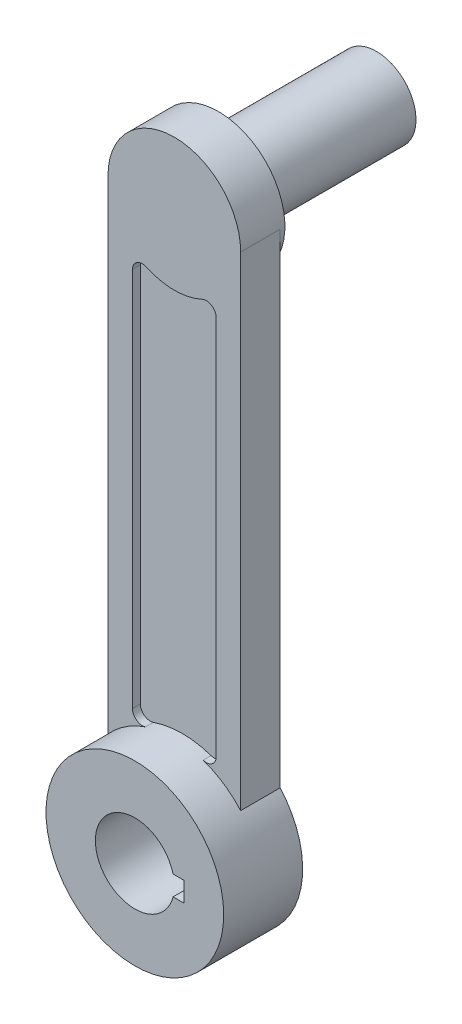
ISO-10303-21;
HEADER;
FILE_DESCRIPTION(('STEP AP214'),'2;1');
FILE_NAME('part.step','',(''),(''),'','','');
FILE_SCHEMA(('AUTOMOTIVE_DESIGN { 1 0 10303 214 1 1 1 1 }'));
ENDSEC;
DATA;
#1=APPLICATION_CONTEXT('core data for automotive mechanical design processes');
#2=APPLICATION_PROTOCOL_DEFINITION('international standard','automotive_design',2000,#1);
#3=PRODUCT_CONTEXT('',#1,'mechanical');
#4=PRODUCT('Part','Part','',(#3));
#5=PRODUCT_RELATED_PRODUCT_CATEGORY('part','',(#4));
#6=PRODUCT_DEFINITION_FORMATION('','',#4);
#7=PRODUCT_DEFINITION_CONTEXT('part definition',#1,'design');
#8=PRODUCT_DEFINITION('design','',#6,#7);
#9=PRODUCT_DEFINITION_SHAPE('','',#8);
#10=(LENGTH_UNIT() NAMED_UNIT(*) SI_UNIT(.MILLI.,.METRE.));
#11=(NAMED_UNIT(*) PLANE_ANGLE_UNIT() SI_UNIT($,.RADIAN.));
#12=(NAMED_UNIT(*) SI_UNIT($,.STERADIAN.) SOLID_ANGLE_UNIT());
#13=UNCERTAINTY_MEASURE_WITH_UNIT(LENGTH_MEASURE(1.E-05),#10,'distance_accuracy_value','');
#14=(GEOMETRIC_REPRESENTATION_CONTEXT(3) GLOBAL_UNCERTAINTY_ASSIGNED_CONTEXT((#13)) GLOBAL_UNIT_ASSIGNED_CONTEXT((#10,
#11,#12)) REPRESENTATION_CONTEXT('',''));
#15=CARTESIAN_POINT('',(0.,0.,0.));
#16=DIRECTION('',(0.,0.,1.));
#17=DIRECTION('',(1.,0.,0.));
#18=AXIS2_PLACEMENT_3D('',#15,#16,#17);
#19=CARTESIAN_POINT('',(0.,0.,-12.7));
#20=DIRECTION('',(0.,0.,1.));
#21=DIRECTION('',(1.,0.,0.));
#22=AXIS2_PLACEMENT_3D('',#19,#20,#21);
#23=PLANE('',#22);
#24=CARTESIAN_POINT('',(0.,174.625,-12.7));
#25=DIRECTION('',(0.,0.,-1.));
#26=DIRECTION('',(-1.,0.,0.));
#27=AXIS2_PLACEMENT_3D('',#24,#25,#26);
#28=CIRCLE('',#27,21.336);
#29=CARTESIAN_POINT('',(-8.95448704663204,155.258997373446,-12.7));
#30=VERTEX_POINT('',#29);
#31=CARTESIAN_POINT('',(-21.3359999999999,174.625,-12.7));
#32=VERTEX_POINT('',#31);
#33=EDGE_CURVE('E63',#30,#32,#28,.T.);
#34=ORIENTED_EDGE('',*,*,#33,.F.);
#35=CARTESIAN_POINT('',(-10.2869999999999,152.377151744494,-12.7));
#36=DIRECTION('',(0.,0.,1.));
#37=DIRECTION('',(1.,0.,0.));
#38=AXIS2_PLACEMENT_3D('',#35,#36,#37);
#39=CIRCLE('',#38,3.175);
#40=CARTESIAN_POINT('',(-13.4619999999999,152.377151744494,-12.7));
#41=VERTEX_POINT('',#40);
#42=EDGE_CURVE('E11',#30,#41,#39,.T.);
#43=ORIENTED_EDGE('',*,*,#42,.T.);
#44=DIRECTION('',(0.,-1.,0.));
#45=VECTOR('',#44,1.);
#46=CARTESIAN_POINT('',(-13.4619999999999,158.072071195707,-12.7));
#47=LINE('',#46,#45);
#48=CARTESIAN_POINT('',(-13.462,30.0373123131881,-12.7));
#49=VERTEX_POINT('',#48);
#50=EDGE_CURVE('E239',#41,#49,#47,.T.);
#51=ORIENTED_EDGE('',*,*,#50,.T.);
#52=CARTESIAN_POINT('',(-10.287,30.0373123131881,-12.7));
#53=DIRECTION('',(0.,0.,1.));
#54=DIRECTION('',(1.,0.,0.));
#55=AXIS2_PLACEMENT_3D('',#52,#53,#54);
#56=CIRCLE('',#55,3.175);
#57=CARTESIAN_POINT('',(-9.25829999999997,27.0335810818693,-12.7));
#58=VERTEX_POINT('',#57);
#59=EDGE_CURVE('E385',#49,#58,#56,.T.);
#60=ORIENTED_EDGE('',*,*,#59,.T.);
#61=CARTESIAN_POINT('',(0.,0.,-12.7));
#62=DIRECTION('',(0.,0.,-1.));
#63=DIRECTION('',(-1.,0.,0.));
#64=AXIS2_PLACEMENT_3D('',#61,#62,#63);
#65=CIRCLE('',#64,28.575);
#66=CARTESIAN_POINT('',(9.25829999999999,27.0335810818693,-12.7));
#67=VERTEX_POINT('',#66);
#68=EDGE_CURVE('E256',#58,#67,#65,.T.);
#69=ORIENTED_EDGE('',*,*,#68,.T.);
#70=CARTESIAN_POINT('',(10.287,30.0373123131881,-12.7));
#71=DIRECTION('',(0.,0.,1.));
#72=DIRECTION('',(1.,0.,0.));
#73=AXIS2_PLACEMENT_3D('',#70,#71,#72);
#74=CIRCLE('',#73,3.175);
#75=CARTESIAN_POINT('',(13.462,30.0373123131881,-12.7));
#76=VERTEX_POINT('',#75);
#77=EDGE_CURVE('E383',#67,#76,#74,.T.);
#78=ORIENTED_EDGE('',*,*,#77,.T.);
#79=DIRECTION('',(0.,1.,0.));
#80=VECTOR('',#79,1.);
#81=CARTESIAN_POINT('',(13.462,25.2052609786132,-12.7));
#82=LINE('',#81,#80);
#83=CARTESIAN_POINT('',(13.462,152.377151744495,-12.7));
#84=VERTEX_POINT('',#83);
#85=EDGE_CURVE('E244',#76,#84,#82,.T.);
#86=ORIENTED_EDGE('',*,*,#85,.T.);
#87=CARTESIAN_POINT('',(10.287,152.377151744495,-12.7));
#88=DIRECTION('',(0.,0.,1.));
#89=DIRECTION('',(1.,0.,0.));
#90=AXIS2_PLACEMENT_3D('',#87,#88,#89);
#91=CIRCLE('',#90,3.175);
#92=CARTESIAN_POINT('',(8.95448704663213,155.258997373446,-12.7));
#93=VERTEX_POINT('',#92);
#94=EDGE_CURVE('E49',#84,#93,#91,.T.);
#95=ORIENTED_EDGE('',*,*,#94,.T.);
#96=CARTESIAN_POINT('',(21.336,174.625,-12.7));
#97=VERTEX_POINT('',#96);
#98=EDGE_CURVE('E56',#97,#93,#28,.T.);
#99=ORIENTED_EDGE('',*,*,#98,.F.);
#100=DIRECTION('',(0.,1.,0.));
#101=VECTOR('',#100,1.);
#102=CARTESIAN_POINT('',(21.336,0.,-12.7));
#103=LINE('',#102,#101);
#104=CARTESIAN_POINT('',(21.336,19.008043797298,-12.7));
#105=VERTEX_POINT('',#104);
#106=EDGE_CURVE('E301',#105,#97,#103,.T.);
#107=ORIENTED_EDGE('',*,*,#106,.F.);
#108=CARTESIAN_POINT('',(0.,0.,-12.7));
#109=DIRECTION('',(0.,0.,1.));
#110=DIRECTION('',(1.,0.,0.));
#111=AXIS2_PLACEMENT_3D('',#108,#109,#110);
#112=CIRCLE('',#111,28.575);
#113=CARTESIAN_POINT('',(-21.336,19.008043797298,-12.7));
#114=VERTEX_POINT('',#113);
#115=EDGE_CURVE('E315',#114,#105,#112,.T.);
#116=ORIENTED_EDGE('',*,*,#115,.F.);
#117=DIRECTION('',(0.,-1.,0.));
#118=VECTOR('',#117,1.);
#119=CARTESIAN_POINT('',(-21.3359999999999,174.625,-12.7));
#120=LINE('',#119,#118);
#121=EDGE_CURVE('E294',#32,#114,#120,.T.);
#122=ORIENTED_EDGE('',*,*,#121,.F.);
#123=EDGE_LOOP('',(#34,#43,#51,#60,#69,#78,#86,#95,#99,#107,#116,#122));
#124=FACE_BOUND('',#123,.T.);
#125=DIRECTION('',(1.,0.,0.));
#126=VECTOR('',#125,1.);
#127=CARTESIAN_POINT('',(0.,3.175,-12.7));
#128=LINE('',#127,#126);
#129=CARTESIAN_POINT('',(12.2967221242085,3.175,-12.7));
#130=VERTEX_POINT('',#129);
#131=CARTESIAN_POINT('',(15.875,3.175,-12.7));
#132=VERTEX_POINT('',#131);
#133=EDGE_CURVE('E231',#130,#132,#128,.T.);
#134=ORIENTED_EDGE('',*,*,#133,.F.);
#135=CARTESIAN_POINT('',(0.,0.,-12.7));
#136=DIRECTION('',(0.,0.,1.));
#137=DIRECTION('',(1.,0.,0.));
#138=AXIS2_PLACEMENT_3D('',#135,#136,#137);
#139=CIRCLE('',#138,12.7);
#140=CARTESIAN_POINT('',(12.2967221242085,-3.175,-12.7));
#141=VERTEX_POINT('',#140);
#142=EDGE_CURVE('E236',#130,#141,#139,.T.);
#143=ORIENTED_EDGE('',*,*,#142,.T.);
#144=DIRECTION('',(-1.,0.,0.));
#145=VECTOR('',#144,1.);
#146=CARTESIAN_POINT('',(0.,-3.175,-12.7));
#147=LINE('',#146,#145);
#148=CARTESIAN_POINT('',(15.875,-3.175,-12.7));
#149=VERTEX_POINT('',#148);
#150=EDGE_CURVE('E228',#149,#141,#147,.T.);
#151=ORIENTED_EDGE('',*,*,#150,.F.);
#152=DIRECTION('',(0.,1.,0.));
#153=VECTOR('',#152,1.);
#154=CARTESIAN_POINT('',(15.875,0.,-12.7));
#155=LINE('',#154,#153);
#156=EDGE_CURVE('E209',#149,#132,#155,.T.);
#157=ORIENTED_EDGE('',*,*,#156,.T.);
#158=EDGE_LOOP('',(#134,#143,#151,#157));
#159=FACE_BOUND('',#158,.T.);
#160=ADVANCED_FACE('F41',(#124,#159),#23,.F.);
#161=CARTESIAN_POINT('',(0.,0.,12.7));
#162=DIRECTION('',(0.,0.,1.));
#163=DIRECTION('',(1.,0.,0.));
#164=AXIS2_PLACEMENT_3D('',#161,#162,#163);
#165=PLANE('',#164);
#166=CARTESIAN_POINT('',(0.,0.,12.7));
#167=DIRECTION('',(0.,0.,1.));
#168=DIRECTION('',(1.,0.,0.));
#169=AXIS2_PLACEMENT_3D('',#166,#167,#168);
#170=CIRCLE('',#169,28.575);
#171=CARTESIAN_POINT('',(28.575,0.,12.7));
#172=VERTEX_POINT('',#171);
#173=EDGE_CURVE('E316',#172,#172,#170,.T.);
#174=ORIENTED_EDGE('',*,*,#173,.T.);
#175=EDGE_LOOP('',(#174));
#176=FACE_BOUND('',#175,.T.);
#177=CARTESIAN_POINT('',(0.,0.,12.7));
#178=DIRECTION('',(0.,0.,1.));
#179=DIRECTION('',(1.,0.,0.));
#180=AXIS2_PLACEMENT_3D('',#177,#178,#179);
#181=CIRCLE('',#180,12.7);
#182=CARTESIAN_POINT('',(12.2967221242085,3.175,12.7));
#183=VERTEX_POINT('',#182);
#184=CARTESIAN_POINT('',(12.2967221242085,-3.175,12.7));
#185=VERTEX_POINT('',#184);
#186=EDGE_CURVE('E234',#183,#185,#181,.T.);
#187=ORIENTED_EDGE('',*,*,#186,.F.);
#188=DIRECTION('',(1.,0.,0.));
#189=VECTOR('',#188,1.);
#190=CARTESIAN_POINT('',(0.,3.175,12.7));
#191=LINE('',#190,#189);
#192=CARTESIAN_POINT('',(15.875,3.175,12.7));
#193=VERTEX_POINT('',#192);
#194=EDGE_CURVE('E213',#183,#193,#191,.T.);
#195=ORIENTED_EDGE('',*,*,#194,.T.);
#196=DIRECTION('',(0.,1.,0.));
#197=VECTOR('',#196,1.);
#198=CARTESIAN_POINT('',(15.875,-3.175,12.7));
#199=LINE('',#198,#197);
#200=CARTESIAN_POINT('',(15.875,-3.175,12.7));
#201=VERTEX_POINT('',#200);
#202=EDGE_CURVE('E206',#201,#193,#199,.T.);
#203=ORIENTED_EDGE('',*,*,#202,.F.);
#204=DIRECTION('',(-1.,0.,0.));
#205=VECTOR('',#204,1.);
#206=CARTESIAN_POINT('',(15.875,-3.175,12.7));
#207=LINE('',#206,#205);
#208=EDGE_CURVE('E216',#201,#185,#207,.T.);
#209=ORIENTED_EDGE('',*,*,#208,.T.);
#210=EDGE_LOOP('',(#187,#195,#203,#209));
#211=FACE_BOUND('',#210,.T.);
#212=ADVANCED_FACE('F224',(#176,#211),#165,.T.);
#213=CARTESIAN_POINT('',(0.,0.,-65.024));
#214=DIRECTION('',(0.,0.,1.));
#215=DIRECTION('',(1.,0.,0.));
#216=AXIS2_PLACEMENT_3D('',#213,#214,#215);
#217=CYLINDRICAL_SURFACE('',#216,12.7);
#218=DIRECTION('',(0.,0.,1.));
#219=VECTOR('',#218,1.);
#220=CARTESIAN_POINT('',(12.2967221242085,3.175,-65.024));
#221=LINE('',#220,#219);
#222=EDGE_CURVE('E325',#183,#130,#221,.F.);
#223=ORIENTED_EDGE('',*,*,#222,.F.);
#224=ORIENTED_EDGE('',*,*,#186,.T.);
#225=DIRECTION('',(0.,0.,1.));
#226=VECTOR('',#225,1.);
#227=CARTESIAN_POINT('',(12.2967221242085,-3.175,-65.024));
#228=LINE('',#227,#226);
#229=EDGE_CURVE('E219',#141,#185,#228,.T.);
#230=ORIENTED_EDGE('',*,*,#229,.F.);
#231=ORIENTED_EDGE('',*,*,#142,.F.);
#232=EDGE_LOOP('',(#223,#224,#230,#231));
#233=FACE_BOUND('',#232,.T.);
#234=ADVANCED_FACE('F480',(#233),#217,.F.);
#235=CARTESIAN_POINT('',(0.,174.625,0.));
#236=DIRECTION('',(0.,0.,1.));
#237=DIRECTION('',(1.,0.,0.));
#238=AXIS2_PLACEMENT_3D('',#235,#236,#237);
#239=PLANE('',#238);
#240=DIRECTION('',(0.,-1.,0.));
#241=VECTOR('',#240,1.);
#242=CARTESIAN_POINT('',(-13.4619999999999,158.072071195707,0.));
#243=LINE('',#242,#241);
#244=CARTESIAN_POINT('',(-13.4619999999999,152.377151744495,0.));
#245=VERTEX_POINT('',#244);
#246=CARTESIAN_POINT('',(-13.462,30.0373123131881,0.));
#247=VERTEX_POINT('',#246);
#248=EDGE_CURVE('E265',#245,#247,#243,.T.);
#249=ORIENTED_EDGE('',*,*,#248,.F.);
#250=CARTESIAN_POINT('',(-10.2869999999999,152.377151744495,0.));
#251=DIRECTION('',(0.,0.,1.));
#252=DIRECTION('',(1.,0.,0.));
#253=AXIS2_PLACEMENT_3D('',#250,#251,#252);
#254=CIRCLE('',#253,3.175);
#255=CARTESIAN_POINT('',(-8.95448704663205,155.258997373446,0.));
#256=VERTEX_POINT('',#255);
#257=EDGE_CURVE('E392',#245,#256,#254,.F.);
#258=ORIENTED_EDGE('',*,*,#257,.T.);
#259=CARTESIAN_POINT('',(0.,174.625,0.));
#260=DIRECTION('',(0.,0.,1.));
#261=DIRECTION('',(1.,0.,0.));
#262=AXIS2_PLACEMENT_3D('',#259,#260,#261);
#263=CIRCLE('',#262,21.336);
#264=CARTESIAN_POINT('',(8.95448704663212,155.258997373446,0.));
#265=VERTEX_POINT('',#264);
#266=EDGE_CURVE('E253',#256,#265,#263,.T.);
#267=ORIENTED_EDGE('',*,*,#266,.T.);
#268=CARTESIAN_POINT('',(10.287,152.377151744495,0.));
#269=DIRECTION('',(0.,0.,1.));
#270=DIRECTION('',(1.,0.,0.));
#271=AXIS2_PLACEMENT_3D('',#268,#269,#270);
#272=CIRCLE('',#271,3.175);
#273=CARTESIAN_POINT('',(13.462,152.377151744495,0.));
#274=VERTEX_POINT('',#273);
#275=EDGE_CURVE('E394',#265,#274,#272,.F.);
#276=ORIENTED_EDGE('',*,*,#275,.T.);
#277=DIRECTION('',(0.,-1.,0.));
#278=VECTOR('',#277,1.);
#279=CARTESIAN_POINT('',(13.462,158.072071195707,0.));
#280=LINE('',#279,#278);
#281=CARTESIAN_POINT('',(13.462,30.0373123131881,0.));
#282=VERTEX_POINT('',#281);
#283=EDGE_CURVE('E277',#274,#282,#280,.T.);
#284=ORIENTED_EDGE('',*,*,#283,.T.);
#285=CARTESIAN_POINT('',(10.287,30.0373123131881,0.));
#286=DIRECTION('',(0.,0.,1.));
#287=DIRECTION('',(1.,0.,0.));
#288=AXIS2_PLACEMENT_3D('',#285,#286,#287);
#289=CIRCLE('',#288,3.175);
#290=CARTESIAN_POINT('',(9.25829999999999,27.0335810818693,0.));
#291=VERTEX_POINT('',#290);
#292=EDGE_CURVE('E389',#282,#291,#289,.F.);
#293=ORIENTED_EDGE('',*,*,#292,.T.);
#294=CARTESIAN_POINT('',(0.,0.,0.));
#295=DIRECTION('',(0.,0.,1.));
#296=DIRECTION('',(1.,0.,0.));
#297=AXIS2_PLACEMENT_3D('',#294,#295,#296);
#298=CIRCLE('',#297,28.575);
#299=CARTESIAN_POINT('',(21.336,19.008043797298,0.));
#300=VERTEX_POINT('',#299);
#301=EDGE_CURVE('E322',#300,#291,#298,.T.);
#302=ORIENTED_EDGE('',*,*,#301,.F.);
#303=DIRECTION('',(0.,1.,0.));
#304=VECTOR('',#303,1.);
#305=CARTESIAN_POINT('',(21.336,0.,0.));
#306=LINE('',#305,#304);
#307=CARTESIAN_POINT('',(21.336,174.625,0.));
#308=VERTEX_POINT('',#307);
#309=EDGE_CURVE('E292',#300,#308,#306,.T.);
#310=ORIENTED_EDGE('',*,*,#309,.T.);
#311=CARTESIAN_POINT('',(0.,174.625,0.));
#312=DIRECTION('',(0.,0.,1.));
#313=DIRECTION('',(1.,0.,0.));
#314=AXIS2_PLACEMENT_3D('',#311,#312,#313);
#315=CIRCLE('',#314,21.336);
#316=CARTESIAN_POINT('',(-21.3359999999999,174.625,0.));
#317=VERTEX_POINT('',#316);
#318=EDGE_CURVE('E290',#308,#317,#315,.T.);
#319=ORIENTED_EDGE('',*,*,#318,.T.);
#320=DIRECTION('',(0.,-1.,0.));
#321=VECTOR('',#320,1.);
#322=CARTESIAN_POINT('',(-21.3359999999999,174.625,0.));
#323=LINE('',#322,#321);
#324=CARTESIAN_POINT('',(-21.336,19.008043797298,0.));
#325=VERTEX_POINT('',#324);
#326=EDGE_CURVE('E295',#317,#325,#323,.T.);
#327=ORIENTED_EDGE('',*,*,#326,.T.);
#328=CARTESIAN_POINT('',(-9.25829999999998,27.0335810818693,0.));
#329=VERTEX_POINT('',#328);
#330=EDGE_CURVE('E319',#329,#325,#298,.T.);
#331=ORIENTED_EDGE('',*,*,#330,.F.);
#332=CARTESIAN_POINT('',(-10.287,30.0373123131881,0.));
#333=DIRECTION('',(0.,0.,1.));
#334=DIRECTION('',(1.,0.,0.));
#335=AXIS2_PLACEMENT_3D('',#332,#333,#334);
#336=CIRCLE('',#335,3.175);
#337=EDGE_CURVE('E387',#329,#247,#336,.F.);
#338=ORIENTED_EDGE('',*,*,#337,.T.);
#339=EDGE_LOOP('',(#249,#258,#267,#276,#284,#293,#302,#310,#319,#327,#331,#338));
#340=FACE_BOUND('',#339,.T.);
#341=ADVANCED_FACE('F425',(#340),#239,.T.);
#342=CARTESIAN_POINT('',(0.,0.,12.7));
#343=DIRECTION('',(0.,0.,-1.));
#344=DIRECTION('',(-1.,0.,0.));
#345=AXIS2_PLACEMENT_3D('',#342,#343,#344);
#346=CYLINDRICAL_SURFACE('',#345,28.575);
#347=ORIENTED_EDGE('',*,*,#173,.F.);
#348=EDGE_LOOP('',(#347));
#349=FACE_BOUND('',#348,.T.);
#350=CARTESIAN_POINT('',(0.,0.,-2.54));
#351=DIRECTION('',(0.,0.,1.));
#352=DIRECTION('',(1.,0.,0.));
#353=AXIS2_PLACEMENT_3D('',#350,#351,#352);
#354=CIRCLE('',#353,28.575);
#355=CARTESIAN_POINT('',(9.25829999999999,27.0335810818693,-2.54));
#356=VERTEX_POINT('',#355);
#357=CARTESIAN_POINT('',(-9.25829999999998,27.0335810818693,-2.54));
#358=VERTEX_POINT('',#357);
#359=EDGE_CURVE('E268',#356,#358,#354,.T.);
#360=ORIENTED_EDGE('',*,*,#359,.T.);
#361=DIRECTION('',(0.,0.,-1.));
#362=VECTOR('',#361,1.);
#363=CARTESIAN_POINT('',(-9.25829999999998,27.0335810818693,12.7));
#364=LINE('',#363,#362);
#365=EDGE_CURVE('E352',#358,#329,#364,.F.);
#366=ORIENTED_EDGE('',*,*,#365,.T.);
#367=ORIENTED_EDGE('',*,*,#330,.T.);
#368=DIRECTION('',(0.,0.,-1.));
#369=VECTOR('',#368,1.);
#370=CARTESIAN_POINT('',(-21.336,19.008043797298,12.7));
#371=LINE('',#370,#369);
#372=EDGE_CURVE('E312',#325,#114,#371,.T.);
#373=ORIENTED_EDGE('',*,*,#372,.T.);
#374=ORIENTED_EDGE('',*,*,#115,.T.);
#375=DIRECTION('',(0.,0.,-1.));
#376=VECTOR('',#375,1.);
#377=CARTESIAN_POINT('',(21.336,19.008043797298,12.7));
#378=LINE('',#377,#376);
#379=EDGE_CURVE('E309',#105,#300,#378,.F.);
#380=ORIENTED_EDGE('',*,*,#379,.T.);
#381=ORIENTED_EDGE('',*,*,#301,.T.);
#382=DIRECTION('',(0.,0.,-1.));
#383=VECTOR('',#382,1.);
#384=CARTESIAN_POINT('',(9.25829999999999,27.0335810818693,12.7));
#385=LINE('',#384,#383);
#386=EDGE_CURVE('E350',#291,#356,#385,.T.);
#387=ORIENTED_EDGE('',*,*,#386,.T.);
#388=EDGE_LOOP('',(#360,#366,#367,#373,#374,#380,#381,#387));
#389=FACE_BOUND('',#388,.T.);
#390=ADVANCED_FACE('F422',(#349,#389),#346,.T.);
#391=CARTESIAN_POINT('',(-21.3359999999999,174.625,-213.253267500183));
#392=DIRECTION('',(-1.,0.,0.));
#393=DIRECTION('',(0.,-1.,0.));
#394=AXIS2_PLACEMENT_3D('',#391,#392,#393);
#395=PLANE('',#394);
#396=ORIENTED_EDGE('',*,*,#372,.F.);
#397=ORIENTED_EDGE('',*,*,#326,.F.);
#398=DIRECTION('',(0.,0.,1.));
#399=VECTOR('',#398,1.);
#400=CARTESIAN_POINT('',(-21.3359999999999,174.625,-213.253267500183));
#401=LINE('',#400,#399);
#402=EDGE_CURVE('E307',#32,#317,#401,.T.);
#403=ORIENTED_EDGE('',*,*,#402,.F.);
#404=ORIENTED_EDGE('',*,*,#121,.T.);
#405=EDGE_LOOP('',(#396,#397,#403,#404));
#406=FACE_BOUND('',#405,.T.);
#407=ADVANCED_FACE('F419',(#406),#395,.T.);
#408=CARTESIAN_POINT('',(21.336,0.,-213.253267500183));
#409=DIRECTION('',(1.,0.,0.));
#410=DIRECTION('',(0.,0.,-1.));
#411=AXIS2_PLACEMENT_3D('',#408,#409,#410);
#412=PLANE('',#411);
#413=ORIENTED_EDGE('',*,*,#379,.F.);
#414=ORIENTED_EDGE('',*,*,#106,.T.);
#415=DIRECTION('',(0.,0.,1.));
#416=VECTOR('',#415,1.);
#417=CARTESIAN_POINT('',(21.336,174.625,-213.253267500183));
#418=LINE('',#417,#416);
#419=EDGE_CURVE('E304',#97,#308,#418,.T.);
#420=ORIENTED_EDGE('',*,*,#419,.T.);
#421=ORIENTED_EDGE('',*,*,#309,.F.);
#422=EDGE_LOOP('',(#413,#414,#420,#421));
#423=FACE_BOUND('',#422,.T.);
#424=ADVANCED_FACE('F429',(#423),#412,.T.);
#425=CARTESIAN_POINT('',(0.,174.625,-213.253267500183));
#426=DIRECTION('',(0.,0.,1.));
#427=DIRECTION('',(1.,0.,0.));
#428=AXIS2_PLACEMENT_3D('',#425,#426,#427);
#429=CYLINDRICAL_SURFACE('',#428,21.336);
#430=ORIENTED_EDGE('',*,*,#98,.T.);
#431=DIRECTION('',(0.,0.,1.));
#432=VECTOR('',#431,1.);
#433=CARTESIAN_POINT('',(8.95448704663213,155.258997373446,-213.253267500183));
#434=LINE('',#433,#432);
#435=CARTESIAN_POINT('',(8.95448704663212,155.258997373446,-10.16));
#436=VERTEX_POINT('',#435);
#437=EDGE_CURVE('E381',#93,#436,#434,.T.);
#438=ORIENTED_EDGE('',*,*,#437,.T.);
#439=CARTESIAN_POINT('',(0.,174.625,-10.16));
#440=DIRECTION('',(0.,0.,-1.));
#441=DIRECTION('',(-1.,0.,0.));
#442=AXIS2_PLACEMENT_3D('',#439,#440,#441);
#443=CIRCLE('',#442,21.336);
#444=CARTESIAN_POINT('',(-8.95448704663204,155.258997373446,-10.16));
#445=VERTEX_POINT('',#444);
#446=EDGE_CURVE('E240',#436,#445,#443,.T.);
#447=ORIENTED_EDGE('',*,*,#446,.T.);
#448=DIRECTION('',(0.,0.,1.));
#449=VECTOR('',#448,1.);
#450=CARTESIAN_POINT('',(-8.95448704663205,155.258997373446,-213.253267500183));
#451=LINE('',#450,#449);
#452=EDGE_CURVE('E378',#445,#30,#451,.F.);
#453=ORIENTED_EDGE('',*,*,#452,.T.);
#454=ORIENTED_EDGE('',*,*,#33,.T.);
#455=ORIENTED_EDGE('',*,*,#402,.T.);
#456=ORIENTED_EDGE('',*,*,#318,.F.);
#457=ORIENTED_EDGE('',*,*,#419,.F.);
#458=EDGE_LOOP('',(#430,#438,#447,#453,#454,#455,#456,#457));
#459=FACE_BOUND('',#458,.T.);
#460=CARTESIAN_POINT('',(0.,174.625,-14.224));
#461=DIRECTION('',(0.,0.,-1.));
#462=DIRECTION('',(-1.,0.,0.));
#463=AXIS2_PLACEMENT_3D('',#460,#461,#462);
#464=CIRCLE('',#463,21.336);
#465=CARTESIAN_POINT('',(-21.3359999999999,174.625,-14.224));
#466=VERTEX_POINT('',#465);
#467=EDGE_CURVE('E285',#466,#466,#464,.T.);
#468=ORIENTED_EDGE('',*,*,#467,.F.);
#469=EDGE_LOOP('',(#468));
#470=FACE_BOUND('',#469,.T.);
#471=ADVANCED_FACE('F404',(#459,#470),#429,.T.);
#472=CARTESIAN_POINT('',(0.,174.625,-14.224));
#473=DIRECTION('',(0.,0.,-1.));
#474=DIRECTION('',(-1.,0.,0.));
#475=AXIS2_PLACEMENT_3D('',#472,#473,#474);
#476=PLANE('',#475);
#477=CARTESIAN_POINT('',(0.,174.625,-14.224));
#478=DIRECTION('',(0.,0.,-1.));
#479=DIRECTION('',(-1.,0.,0.));
#480=AXIS2_PLACEMENT_3D('',#477,#478,#479);
#481=CIRCLE('',#480,12.7);
#482=CARTESIAN_POINT('',(-12.7,174.625,-14.224));
#483=VERTEX_POINT('',#482);
#484=EDGE_CURVE('E274',#483,#483,#481,.T.);
#485=ORIENTED_EDGE('',*,*,#484,.F.);
#486=EDGE_LOOP('',(#485));
#487=FACE_BOUND('',#486,.T.);
#488=ORIENTED_EDGE('',*,*,#467,.T.);
#489=EDGE_LOOP('',(#488));
#490=FACE_BOUND('',#489,.T.);
#491=ADVANCED_FACE('F537',(#487,#490),#476,.T.);
#492=CARTESIAN_POINT('',(0.,174.625,-65.024));
#493=DIRECTION('',(0.,0.,1.));
#494=DIRECTION('',(1.,0.,0.));
#495=AXIS2_PLACEMENT_3D('',#492,#493,#494);
#496=CYLINDRICAL_SURFACE('',#495,12.7);
#497=CARTESIAN_POINT('',(0.,174.625,-65.024));
#498=DIRECTION('',(0.,0.,-1.));
#499=DIRECTION('',(-1.,0.,0.));
#500=AXIS2_PLACEMENT_3D('',#497,#498,#499);
#501=CIRCLE('',#500,12.7);
#502=CARTESIAN_POINT('',(-12.7,174.625,-65.024));
#503=VERTEX_POINT('',#502);
#504=EDGE_CURVE('E282',#503,#503,#501,.T.);
#505=ORIENTED_EDGE('',*,*,#504,.F.);
#506=EDGE_LOOP('',(#505));
#507=FACE_BOUND('',#506,.T.);
#508=ORIENTED_EDGE('',*,*,#484,.T.);
#509=EDGE_LOOP('',(#508));
#510=FACE_BOUND('',#509,.T.);
#511=ADVANCED_FACE('F533',(#507,#510),#496,.T.);
#512=CARTESIAN_POINT('',(0.,174.625,-65.024));
#513=DIRECTION('',(0.,0.,-1.));
#514=DIRECTION('',(-1.,0.,0.));
#515=AXIS2_PLACEMENT_3D('',#512,#513,#514);
#516=PLANE('',#515);
#517=ORIENTED_EDGE('',*,*,#504,.T.);
#518=EDGE_LOOP('',(#517));
#519=FACE_BOUND('',#518,.T.);
#520=ADVANCED_FACE('F530',(#519),#516,.T.);
#521=CARTESIAN_POINT('',(0.,174.625,-2.54));
#522=DIRECTION('',(0.,0.,1.));
#523=DIRECTION('',(1.,0.,0.));
#524=AXIS2_PLACEMENT_3D('',#521,#522,#523);
#525=CYLINDRICAL_SURFACE('',#524,21.336);
#526=ORIENTED_EDGE('',*,*,#266,.F.);
#527=DIRECTION('',(0.,0.,1.));
#528=VECTOR('',#527,1.);
#529=CARTESIAN_POINT('',(-8.95448704663205,155.258997373446,-2.54));
#530=LINE('',#529,#528);
#531=CARTESIAN_POINT('',(-8.95448704663205,155.258997373446,-2.54));
#532=VERTEX_POINT('',#531);
#533=EDGE_CURVE('E376',#256,#532,#530,.F.);
#534=ORIENTED_EDGE('',*,*,#533,.T.);
#535=CARTESIAN_POINT('',(0.,174.625,-2.54));
#536=DIRECTION('',(0.,0.,1.));
#537=DIRECTION('',(1.,0.,0.));
#538=AXIS2_PLACEMENT_3D('',#535,#536,#537);
#539=CIRCLE('',#538,21.336);
#540=CARTESIAN_POINT('',(8.95448704663212,155.258997373446,-2.54));
#541=VERTEX_POINT('',#540);
#542=EDGE_CURVE('E261',#532,#541,#539,.T.);
#543=ORIENTED_EDGE('',*,*,#542,.T.);
#544=DIRECTION('',(0.,0.,1.));
#545=VECTOR('',#544,1.);
#546=CARTESIAN_POINT('',(8.95448704663212,155.258997373446,-2.54));
#547=LINE('',#546,#545);
#548=EDGE_CURVE('E373',#541,#265,#547,.T.);
#549=ORIENTED_EDGE('',*,*,#548,.T.);
#550=EDGE_LOOP('',(#526,#534,#543,#549));
#551=FACE_BOUND('',#550,.T.);
#552=ADVANCED_FACE('F451',(#551),#525,.T.);
#553=CARTESIAN_POINT('',(13.462,158.072071195707,-2.54));
#554=DIRECTION('',(-1.,0.,0.));
#555=DIRECTION('',(0.,-1.,0.));
#556=AXIS2_PLACEMENT_3D('',#553,#554,#555);
#557=PLANE('',#556);
#558=DIRECTION('',(0.,-1.,0.));
#559=VECTOR('',#558,1.);
#560=CARTESIAN_POINT('',(13.462,158.072071195707,-2.54));
#561=LINE('',#560,#559);
#562=CARTESIAN_POINT('',(13.462,152.377151744495,-2.54));
#563=VERTEX_POINT('',#562);
#564=CARTESIAN_POINT('',(13.462,30.0373123131881,-2.54));
#565=VERTEX_POINT('',#564);
#566=EDGE_CURVE('E264',#563,#565,#561,.T.);
#567=ORIENTED_EDGE('',*,*,#566,.T.);
#568=DIRECTION('',(0.,0.,-1.));
#569=VECTOR('',#568,1.);
#570=CARTESIAN_POINT('',(13.462,30.0373123131881,-2.54));
#571=LINE('',#570,#569);
#572=EDGE_CURVE('E370',#565,#282,#571,.F.);
#573=ORIENTED_EDGE('',*,*,#572,.T.);
#574=ORIENTED_EDGE('',*,*,#283,.F.);
#575=DIRECTION('',(0.,0.,-1.));
#576=VECTOR('',#575,1.);
#577=CARTESIAN_POINT('',(13.462,152.377151744495,-2.54));
#578=LINE('',#577,#576);
#579=EDGE_CURVE('E368',#274,#563,#578,.T.);
#580=ORIENTED_EDGE('',*,*,#579,.T.);
#581=EDGE_LOOP('',(#567,#573,#574,#580));
#582=FACE_BOUND('',#581,.T.);
#583=ADVANCED_FACE('F443',(#582),#557,.T.);
#584=CARTESIAN_POINT('',(-13.4619999999999,158.072071195707,-2.54));
#585=DIRECTION('',(-1.,0.,0.));
#586=DIRECTION('',(0.,-1.,0.));
#587=AXIS2_PLACEMENT_3D('',#584,#585,#586);
#588=PLANE('',#587);
#589=ORIENTED_EDGE('',*,*,#248,.T.);
#590=DIRECTION('',(0.,0.,1.));
#591=VECTOR('',#590,1.);
#592=CARTESIAN_POINT('',(-13.462,30.0373123131881,-2.54));
#593=LINE('',#592,#591);
#594=CARTESIAN_POINT('',(-13.462,30.0373123131881,-2.54));
#595=VERTEX_POINT('',#594);
#596=EDGE_CURVE('E358',#247,#595,#593,.F.);
#597=ORIENTED_EDGE('',*,*,#596,.T.);
#598=DIRECTION('',(0.,-1.,0.));
#599=VECTOR('',#598,1.);
#600=CARTESIAN_POINT('',(-13.4619999999999,158.072071195707,-2.54));
#601=LINE('',#600,#599);
#602=CARTESIAN_POINT('',(-13.4619999999999,152.377151744495,-2.54));
#603=VERTEX_POINT('',#602);
#604=EDGE_CURVE('E271',#603,#595,#601,.T.);
#605=ORIENTED_EDGE('',*,*,#604,.F.);
#606=DIRECTION('',(0.,0.,1.));
#607=VECTOR('',#606,1.);
#608=CARTESIAN_POINT('',(-13.4619999999999,152.377151744495,-2.54));
#609=LINE('',#608,#607);
#610=EDGE_CURVE('E355',#603,#245,#609,.T.);
#611=ORIENTED_EDGE('',*,*,#610,.T.);
#612=EDGE_LOOP('',(#589,#597,#605,#611));
#613=FACE_BOUND('',#612,.T.);
#614=ADVANCED_FACE('F460',(#613),#588,.F.);
#615=CARTESIAN_POINT('',(0.,174.625,-2.54));
#616=DIRECTION('',(0.,0.,1.));
#617=DIRECTION('',(1.,0.,0.));
#618=AXIS2_PLACEMENT_3D('',#615,#616,#617);
#619=PLANE('',#618);
#620=ORIENTED_EDGE('',*,*,#604,.T.);
#621=CARTESIAN_POINT('',(-10.287,30.0373123131881,-2.54));
#622=DIRECTION('',(0.,0.,1.));
#623=DIRECTION('',(1.,0.,0.));
#624=AXIS2_PLACEMENT_3D('',#621,#622,#623);
#625=CIRCLE('',#624,3.175);
#626=EDGE_CURVE('E366',#595,#358,#625,.T.);
#627=ORIENTED_EDGE('',*,*,#626,.T.);
#628=ORIENTED_EDGE('',*,*,#359,.F.);
#629=CARTESIAN_POINT('',(10.287,30.0373123131881,-2.54));
#630=DIRECTION('',(0.,0.,1.));
#631=DIRECTION('',(1.,0.,0.));
#632=AXIS2_PLACEMENT_3D('',#629,#630,#631);
#633=CIRCLE('',#632,3.175);
#634=EDGE_CURVE('E364',#356,#565,#633,.T.);
#635=ORIENTED_EDGE('',*,*,#634,.T.);
#636=ORIENTED_EDGE('',*,*,#566,.F.);
#637=CARTESIAN_POINT('',(10.287,152.377151744495,-2.54));
#638=DIRECTION('',(0.,0.,1.));
#639=DIRECTION('',(1.,0.,0.));
#640=AXIS2_PLACEMENT_3D('',#637,#638,#639);
#641=CIRCLE('',#640,3.175);
#642=EDGE_CURVE('E360',#563,#541,#641,.T.);
#643=ORIENTED_EDGE('',*,*,#642,.T.);
#644=ORIENTED_EDGE('',*,*,#542,.F.);
#645=CARTESIAN_POINT('',(-10.2869999999999,152.377151744495,-2.54));
#646=DIRECTION('',(0.,0.,1.));
#647=DIRECTION('',(1.,0.,0.));
#648=AXIS2_PLACEMENT_3D('',#645,#646,#647);
#649=CIRCLE('',#648,3.175);
#650=EDGE_CURVE('E362',#532,#603,#649,.T.);
#651=ORIENTED_EDGE('',*,*,#650,.T.);
#652=EDGE_LOOP('',(#620,#627,#628,#635,#636,#643,#644,#651));
#653=FACE_BOUND('',#652,.T.);
#654=ADVANCED_FACE('F436',(#653),#619,.T.);
#655=CARTESIAN_POINT('',(-13.4619999999999,158.072071195707,-10.16));
#656=DIRECTION('',(1.,0.,0.));
#657=DIRECTION('',(0.,1.,0.));
#658=AXIS2_PLACEMENT_3D('',#655,#656,#657);
#659=PLANE('',#658);
#660=DIRECTION('',(0.,-1.,0.));
#661=VECTOR('',#660,1.);
#662=CARTESIAN_POINT('',(-13.4619999999999,158.072071195707,-10.16));
#663=LINE('',#662,#661);
#664=CARTESIAN_POINT('',(-13.4619999999999,152.377151744494,-10.16));
#665=VERTEX_POINT('',#664);
#666=CARTESIAN_POINT('',(-13.462,30.0373123131881,-10.16));
#667=VERTEX_POINT('',#666);
#668=EDGE_CURVE('E243',#665,#667,#663,.T.);
#669=ORIENTED_EDGE('',*,*,#668,.T.);
#670=DIRECTION('',(0.,0.,1.));
#671=VECTOR('',#670,1.);
#672=CARTESIAN_POINT('',(-13.462,30.0373123131881,-12.7));
#673=LINE('',#672,#671);
#674=EDGE_CURVE('E347',#667,#49,#673,.F.);
#675=ORIENTED_EDGE('',*,*,#674,.T.);
#676=ORIENTED_EDGE('',*,*,#50,.F.);
#677=DIRECTION('',(0.,0.,-1.));
#678=VECTOR('',#677,1.);
#679=CARTESIAN_POINT('',(-13.4619999999999,152.377151744494,-10.16));
#680=LINE('',#679,#678);
#681=EDGE_CURVE('E345',#41,#665,#680,.F.);
#682=ORIENTED_EDGE('',*,*,#681,.T.);
#683=EDGE_LOOP('',(#669,#675,#676,#682));
#684=FACE_BOUND('',#683,.T.);
#685=ADVANCED_FACE('F506',(#684),#659,.T.);
#686=CARTESIAN_POINT('',(0.,0.,-10.16));
#687=DIRECTION('',(0.,0.,-1.));
#688=DIRECTION('',(-1.,0.,0.));
#689=AXIS2_PLACEMENT_3D('',#686,#687,#688);
#690=CYLINDRICAL_SURFACE('',#689,28.575);
#691=CARTESIAN_POINT('',(0.,0.,-10.16));
#692=DIRECTION('',(0.,0.,-1.));
#693=DIRECTION('',(-1.,0.,0.));
#694=AXIS2_PLACEMENT_3D('',#691,#692,#693);
#695=CIRCLE('',#694,28.575);
#696=CARTESIAN_POINT('',(-9.25829999999997,27.0335810818693,-10.16));
#697=VERTEX_POINT('',#696);
#698=CARTESIAN_POINT('',(9.25829999999999,27.0335810818693,-10.16));
#699=VERTEX_POINT('',#698);
#700=EDGE_CURVE('E247',#697,#699,#695,.T.);
#701=ORIENTED_EDGE('',*,*,#700,.T.);
#702=DIRECTION('',(0.,0.,-1.));
#703=VECTOR('',#702,1.);
#704=CARTESIAN_POINT('',(9.25829999999999,27.0335810818693,-10.16));
#705=LINE('',#704,#703);
#706=EDGE_CURVE('E329',#699,#67,#705,.T.);
#707=ORIENTED_EDGE('',*,*,#706,.T.);
#708=ORIENTED_EDGE('',*,*,#68,.F.);
#709=DIRECTION('',(0.,0.,-1.));
#710=VECTOR('',#709,1.);
#711=CARTESIAN_POINT('',(-9.25829999999998,27.0335810818693,-10.16));
#712=LINE('',#711,#710);
#713=EDGE_CURVE('E327',#58,#697,#712,.F.);
#714=ORIENTED_EDGE('',*,*,#713,.T.);
#715=EDGE_LOOP('',(#701,#707,#708,#714));
#716=FACE_BOUND('',#715,.T.);
#717=ADVANCED_FACE('F501',(#716),#690,.T.);
#718=CARTESIAN_POINT('',(13.462,25.2052609786132,-10.16));
#719=DIRECTION('',(-1.,0.,0.));
#720=DIRECTION('',(0.,-1.,0.));
#721=AXIS2_PLACEMENT_3D('',#718,#719,#720);
#722=PLANE('',#721);
#723=ORIENTED_EDGE('',*,*,#85,.F.);
#724=DIRECTION('',(0.,0.,1.));
#725=VECTOR('',#724,1.);
#726=CARTESIAN_POINT('',(13.462,30.0373123131881,-10.16));
#727=LINE('',#726,#725);
#728=CARTESIAN_POINT('',(13.462,30.0373123131881,-10.16));
#729=VERTEX_POINT('',#728);
#730=EDGE_CURVE('E335',#76,#729,#727,.T.);
#731=ORIENTED_EDGE('',*,*,#730,.T.);
#732=DIRECTION('',(0.,1.,0.));
#733=VECTOR('',#732,1.);
#734=CARTESIAN_POINT('',(13.462,25.2052609786132,-10.16));
#735=LINE('',#734,#733);
#736=CARTESIAN_POINT('',(13.462,152.377151744495,-10.16));
#737=VERTEX_POINT('',#736);
#738=EDGE_CURVE('E250',#729,#737,#735,.T.);
#739=ORIENTED_EDGE('',*,*,#738,.T.);
#740=DIRECTION('',(0.,0.,-1.));
#741=VECTOR('',#740,1.);
#742=CARTESIAN_POINT('',(13.462,152.377151744495,-12.7));
#743=LINE('',#742,#741);
#744=EDGE_CURVE('E332',#737,#84,#743,.T.);
#745=ORIENTED_EDGE('',*,*,#744,.T.);
#746=EDGE_LOOP('',(#723,#731,#739,#745));
#747=FACE_BOUND('',#746,.T.);
#748=ADVANCED_FACE('F509',(#747),#722,.T.);
#749=CARTESIAN_POINT('',(0.,174.625,-10.16));
#750=DIRECTION('',(0.,0.,-1.));
#751=DIRECTION('',(-1.,0.,0.));
#752=AXIS2_PLACEMENT_3D('',#749,#750,#751);
#753=PLANE('',#752);
#754=ORIENTED_EDGE('',*,*,#738,.F.);
#755=CARTESIAN_POINT('',(10.287,30.0373123131881,-10.16));
#756=DIRECTION('',(0.,0.,-1.));
#757=DIRECTION('',(-1.,0.,0.));
#758=AXIS2_PLACEMENT_3D('',#755,#756,#757);
#759=CIRCLE('',#758,3.175);
#760=EDGE_CURVE('E343',#729,#699,#759,.T.);
#761=ORIENTED_EDGE('',*,*,#760,.T.);
#762=ORIENTED_EDGE('',*,*,#700,.F.);
#763=CARTESIAN_POINT('',(-10.287,30.0373123131881,-10.16));
#764=DIRECTION('',(0.,0.,-1.));
#765=DIRECTION('',(-1.,0.,0.));
#766=AXIS2_PLACEMENT_3D('',#763,#764,#765);
#767=CIRCLE('',#766,3.175);
#768=EDGE_CURVE('E341',#697,#667,#767,.T.);
#769=ORIENTED_EDGE('',*,*,#768,.T.);
#770=ORIENTED_EDGE('',*,*,#668,.F.);
#771=CARTESIAN_POINT('',(-10.2869999999999,152.377151744494,-10.16));
#772=DIRECTION('',(0.,0.,-1.));
#773=DIRECTION('',(-1.,0.,0.));
#774=AXIS2_PLACEMENT_3D('',#771,#772,#773);
#775=CIRCLE('',#774,3.175);
#776=EDGE_CURVE('E337',#665,#445,#775,.T.);
#777=ORIENTED_EDGE('',*,*,#776,.T.);
#778=ORIENTED_EDGE('',*,*,#446,.F.);
#779=CARTESIAN_POINT('',(10.287,152.377151744495,-10.16));
#780=DIRECTION('',(0.,0.,-1.));
#781=DIRECTION('',(-1.,0.,0.));
#782=AXIS2_PLACEMENT_3D('',#779,#780,#781);
#783=CIRCLE('',#782,3.175);
#784=EDGE_CURVE('E339',#436,#737,#783,.T.);
#785=ORIENTED_EDGE('',*,*,#784,.T.);
#786=EDGE_LOOP('',(#754,#761,#762,#769,#770,#777,#778,#785));
#787=FACE_BOUND('',#786,.T.);
#788=ADVANCED_FACE('F409',(#787),#753,.T.);
#789=CARTESIAN_POINT('',(15.875,-3.175,-65.024));
#790=DIRECTION('',(1.,0.,0.));
#791=DIRECTION('',(0.,0.,-1.));
#792=AXIS2_PLACEMENT_3D('',#789,#790,#791);
#793=PLANE('',#792);
#794=DIRECTION('',(0.,0.,1.));
#795=VECTOR('',#794,1.);
#796=CARTESIAN_POINT('',(15.875,-3.175,-65.024));
#797=LINE('',#796,#795);
#798=EDGE_CURVE('E201',#149,#201,#797,.T.);
#799=ORIENTED_EDGE('',*,*,#798,.T.);
#800=ORIENTED_EDGE('',*,*,#202,.T.);
#801=DIRECTION('',(0.,0.,1.));
#802=VECTOR('',#801,1.);
#803=CARTESIAN_POINT('',(15.875,3.175,-65.024));
#804=LINE('',#803,#802);
#805=EDGE_CURVE('E212',#132,#193,#804,.T.);
#806=ORIENTED_EDGE('',*,*,#805,.F.);
#807=ORIENTED_EDGE('',*,*,#156,.F.);
#808=EDGE_LOOP('',(#799,#800,#806,#807));
#809=FACE_BOUND('',#808,.T.);
#810=ADVANCED_FACE('F203',(#809),#793,.F.);
#811=CARTESIAN_POINT('',(0.,3.175,-65.024));
#812=DIRECTION('',(0.,-1.,0.));
#813=DIRECTION('',(1.,0.,0.));
#814=AXIS2_PLACEMENT_3D('',#811,#812,#813);
#815=PLANE('',#814);
#816=ORIENTED_EDGE('',*,*,#133,.T.);
#817=ORIENTED_EDGE('',*,*,#805,.T.);
#818=ORIENTED_EDGE('',*,*,#194,.F.);
#819=ORIENTED_EDGE('',*,*,#222,.T.);
#820=EDGE_LOOP('',(#816,#817,#818,#819));
#821=FACE_BOUND('',#820,.T.);
#822=ADVANCED_FACE('F493',(#821),#815,.T.);
#823=CARTESIAN_POINT('',(15.875,-3.175,-65.024));
#824=DIRECTION('',(0.,1.,0.));
#825=DIRECTION('',(-1.,0.,0.));
#826=AXIS2_PLACEMENT_3D('',#823,#824,#825);
#827=PLANE('',#826);
#828=ORIENTED_EDGE('',*,*,#150,.T.);
#829=ORIENTED_EDGE('',*,*,#229,.T.);
#830=ORIENTED_EDGE('',*,*,#208,.F.);
#831=ORIENTED_EDGE('',*,*,#798,.F.);
#832=EDGE_LOOP('',(#828,#829,#830,#831));
#833=FACE_BOUND('',#832,.T.);
#834=ADVANCED_FACE('F217',(#833),#827,.T.);
#835=CARTESIAN_POINT('',(10.287,30.0373123131881,-10.16));
#836=DIRECTION('',(0.,0.,-1.));
#837=DIRECTION('',(-1.,0.,0.));
#838=AXIS2_PLACEMENT_3D('',#835,#836,#837);
#839=CYLINDRICAL_SURFACE('',#838,3.175);
#840=ORIENTED_EDGE('',*,*,#760,.F.);
#841=ORIENTED_EDGE('',*,*,#730,.F.);
#842=ORIENTED_EDGE('',*,*,#77,.F.);
#843=ORIENTED_EDGE('',*,*,#706,.F.);
#844=EDGE_LOOP('',(#840,#841,#842,#843));
#845=FACE_BOUND('',#844,.T.);
#846=ADVANCED_FACE('F472',(#845),#839,.F.);
#847=CARTESIAN_POINT('',(-10.287,30.0373123131881,-10.16));
#848=DIRECTION('',(0.,0.,-1.));
#849=DIRECTION('',(-1.,0.,0.));
#850=AXIS2_PLACEMENT_3D('',#847,#848,#849);
#851=CYLINDRICAL_SURFACE('',#850,3.175);
#852=ORIENTED_EDGE('',*,*,#768,.F.);
#853=ORIENTED_EDGE('',*,*,#713,.F.);
#854=ORIENTED_EDGE('',*,*,#59,.F.);
#855=ORIENTED_EDGE('',*,*,#674,.F.);
#856=EDGE_LOOP('',(#852,#853,#854,#855));
#857=FACE_BOUND('',#856,.T.);
#858=ADVANCED_FACE('F465',(#857),#851,.F.);
#859=CARTESIAN_POINT('',(-10.287,30.0373123131881,12.7));
#860=DIRECTION('',(0.,0.,-1.));
#861=DIRECTION('',(-1.,0.,0.));
#862=AXIS2_PLACEMENT_3D('',#859,#860,#861);
#863=CYLINDRICAL_SURFACE('',#862,3.175);
#864=ORIENTED_EDGE('',*,*,#626,.F.);
#865=ORIENTED_EDGE('',*,*,#596,.F.);
#866=ORIENTED_EDGE('',*,*,#337,.F.);
#867=ORIENTED_EDGE('',*,*,#365,.F.);
#868=EDGE_LOOP('',(#864,#865,#866,#867));
#869=FACE_BOUND('',#868,.T.);
#870=ADVANCED_FACE('F463',(#869),#863,.F.);
#871=CARTESIAN_POINT('',(10.287,30.0373123131881,12.7));
#872=DIRECTION('',(0.,0.,-1.));
#873=DIRECTION('',(-1.,0.,0.));
#874=AXIS2_PLACEMENT_3D('',#871,#872,#873);
#875=CYLINDRICAL_SURFACE('',#874,3.175);
#876=ORIENTED_EDGE('',*,*,#634,.F.);
#877=ORIENTED_EDGE('',*,*,#386,.F.);
#878=ORIENTED_EDGE('',*,*,#292,.F.);
#879=ORIENTED_EDGE('',*,*,#572,.F.);
#880=EDGE_LOOP('',(#876,#877,#878,#879));
#881=FACE_BOUND('',#880,.T.);
#882=ADVANCED_FACE('F440',(#881),#875,.F.);
#883=CARTESIAN_POINT('',(-10.2869999999999,152.377151744495,-2.54));
#884=DIRECTION('',(0.,0.,1.));
#885=DIRECTION('',(1.,0.,0.));
#886=AXIS2_PLACEMENT_3D('',#883,#884,#885);
#887=CYLINDRICAL_SURFACE('',#886,3.175);
#888=ORIENTED_EDGE('',*,*,#650,.F.);
#889=ORIENTED_EDGE('',*,*,#533,.F.);
#890=ORIENTED_EDGE('',*,*,#257,.F.);
#891=ORIENTED_EDGE('',*,*,#610,.F.);
#892=EDGE_LOOP('',(#888,#889,#890,#891));
#893=FACE_BOUND('',#892,.T.);
#894=ADVANCED_FACE('F458',(#893),#887,.F.);
#895=CARTESIAN_POINT('',(10.287,152.377151744495,-2.54));
#896=DIRECTION('',(0.,0.,1.));
#897=DIRECTION('',(1.,0.,0.));
#898=AXIS2_PLACEMENT_3D('',#895,#896,#897);
#899=CYLINDRICAL_SURFACE('',#898,3.175);
#900=ORIENTED_EDGE('',*,*,#642,.F.);
#901=ORIENTED_EDGE('',*,*,#579,.F.);
#902=ORIENTED_EDGE('',*,*,#275,.F.);
#903=ORIENTED_EDGE('',*,*,#548,.F.);
#904=EDGE_LOOP('',(#900,#901,#902,#903));
#905=FACE_BOUND('',#904,.T.);
#906=ADVANCED_FACE('F449',(#905),#899,.F.);
#907=CARTESIAN_POINT('',(10.287,152.377151744495,-213.253267500183));
#908=DIRECTION('',(0.,0.,1.));
#909=DIRECTION('',(1.,0.,0.));
#910=AXIS2_PLACEMENT_3D('',#907,#908,#909);
#911=CYLINDRICAL_SURFACE('',#910,3.175);
#912=ORIENTED_EDGE('',*,*,#784,.F.);
#913=ORIENTED_EDGE('',*,*,#437,.F.);
#914=ORIENTED_EDGE('',*,*,#94,.F.);
#915=ORIENTED_EDGE('',*,*,#744,.F.);
#916=EDGE_LOOP('',(#912,#913,#914,#915));
#917=FACE_BOUND('',#916,.T.);
#918=ADVANCED_FACE('F402',(#917),#911,.F.);
#919=CARTESIAN_POINT('',(-10.2869999999999,152.377151744494,-213.253267500183));
#920=DIRECTION('',(0.,0.,1.));
#921=DIRECTION('',(1.,0.,0.));
#922=AXIS2_PLACEMENT_3D('',#919,#920,#921);
#923=CYLINDRICAL_SURFACE('',#922,3.175);
#924=ORIENTED_EDGE('',*,*,#776,.F.);
#925=ORIENTED_EDGE('',*,*,#681,.F.);
#926=ORIENTED_EDGE('',*,*,#42,.F.);
#927=ORIENTED_EDGE('',*,*,#452,.F.);
#928=EDGE_LOOP('',(#924,#925,#926,#927));
#929=FACE_BOUND('',#928,.T.);
#930=ADVANCED_FACE('F43',(#929),#923,.F.);
#931=CLOSED_SHELL('',(#160,#212,#234,#341,#390,#407,#424,#471,#491,#511,#520,#552,#583,#614,
#654,#685,#717,#748,#788,#810,#822,#834,#846,#858,#870,#882,#894,#906,#918,#930));
#932=MANIFOLD_SOLID_BREP('B2',#931);
#933=ADVANCED_BREP_SHAPE_REPRESENTATION('',(#18,#932),#14);
#934=SHAPE_DEFINITION_REPRESENTATION(#9,#933);
ENDSEC;
END-ISO-10303-21;
